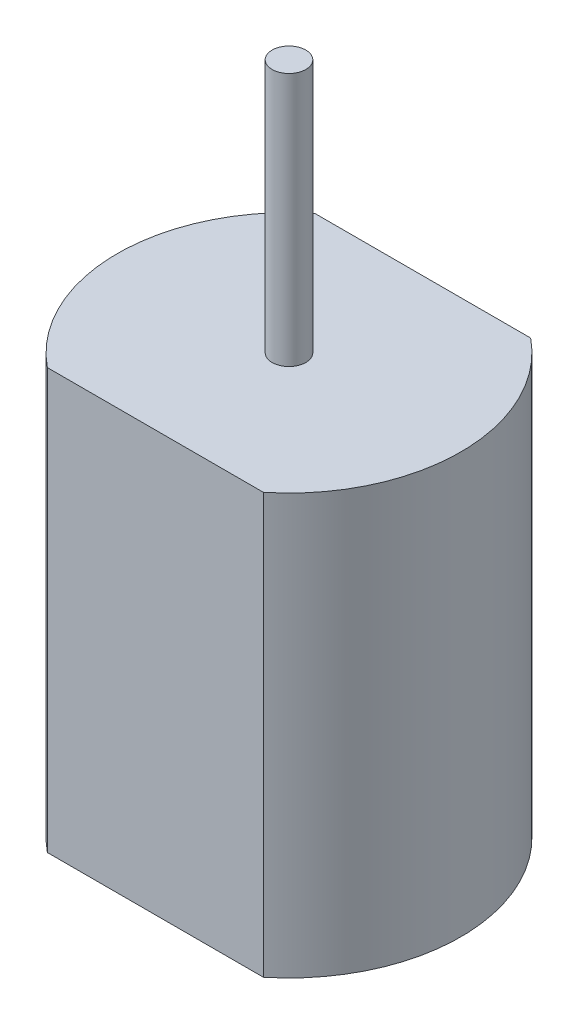
ISO-10303-21;
HEADER;
FILE_DESCRIPTION(('STEP AP214'),'2;1');
FILE_NAME('part.step','',(''),(''),'','','');
FILE_SCHEMA(('AUTOMOTIVE_DESIGN { 1 0 10303 214 1 1 1 1 }'));
ENDSEC;
DATA;
#1=APPLICATION_CONTEXT('core data for automotive mechanical design processes');
#2=APPLICATION_PROTOCOL_DEFINITION('international standard','automotive_design',2000,#1);
#3=PRODUCT_CONTEXT('',#1,'mechanical');
#4=PRODUCT('Part','Part','',(#3));
#5=PRODUCT_RELATED_PRODUCT_CATEGORY('part','',(#4));
#6=PRODUCT_DEFINITION_FORMATION('','',#4);
#7=PRODUCT_DEFINITION_CONTEXT('part definition',#1,'design');
#8=PRODUCT_DEFINITION('design','',#6,#7);
#9=PRODUCT_DEFINITION_SHAPE('','',#8);
#10=(LENGTH_UNIT() NAMED_UNIT(*) SI_UNIT(.MILLI.,.METRE.));
#11=(NAMED_UNIT(*) PLANE_ANGLE_UNIT() SI_UNIT($,.RADIAN.));
#12=(NAMED_UNIT(*) SI_UNIT($,.STERADIAN.) SOLID_ANGLE_UNIT());
#13=UNCERTAINTY_MEASURE_WITH_UNIT(LENGTH_MEASURE(1.E-05),#10,'distance_accuracy_value','');
#14=(GEOMETRIC_REPRESENTATION_CONTEXT(3) GLOBAL_UNCERTAINTY_ASSIGNED_CONTEXT((#13)) GLOBAL_UNIT_ASSIGNED_CONTEXT((#10,
#11,#12)) REPRESENTATION_CONTEXT('',''));
#15=CARTESIAN_POINT('',(0.,0.,0.));
#16=DIRECTION('',(0.,0.,1.));
#17=DIRECTION('',(1.,0.,0.));
#18=AXIS2_PLACEMENT_3D('',#15,#16,#17);
#19=CARTESIAN_POINT('',(0.,18.7,0.));
#20=DIRECTION('',(0.,-1.,0.));
#21=DIRECTION('',(0.,0.,-1.));
#22=AXIS2_PLACEMENT_3D('',#19,#20,#21);
#23=CYLINDRICAL_SURFACE('',#22,7.65);
#24=CARTESIAN_POINT('',(0.,0.,0.));
#25=DIRECTION('',(0.,1.,0.));
#26=DIRECTION('',(0.,0.,1.));
#27=AXIS2_PLACEMENT_3D('',#24,#25,#26);
#28=CIRCLE('',#27,7.65);
#29=CARTESIAN_POINT('',(4.80832611206852,0.,5.95));
#30=VERTEX_POINT('',#29);
#31=CARTESIAN_POINT('',(4.80832611206852,0.,-5.95));
#32=VERTEX_POINT('',#31);
#33=EDGE_CURVE('E113',#30,#32,#28,.T.);
#34=ORIENTED_EDGE('',*,*,#33,.T.);
#35=DIRECTION('',(0.,-1.,0.));
#36=VECTOR('',#35,1.);
#37=CARTESIAN_POINT('',(4.80832611206852,18.7,-5.95));
#38=LINE('',#37,#36);
#39=CARTESIAN_POINT('',(4.80832611206852,18.7,-5.95));
#40=VERTEX_POINT('',#39);
#41=EDGE_CURVE('E11',#40,#32,#38,.T.);
#42=ORIENTED_EDGE('',*,*,#41,.F.);
#43=CARTESIAN_POINT('',(0.,18.7,0.));
#44=DIRECTION('',(0.,1.,0.));
#45=DIRECTION('',(0.,0.,1.));
#46=AXIS2_PLACEMENT_3D('',#43,#44,#45);
#47=CIRCLE('',#46,7.65);
#48=CARTESIAN_POINT('',(4.80832611206852,18.7,5.95));
#49=VERTEX_POINT('',#48);
#50=EDGE_CURVE('E97',#49,#40,#47,.T.);
#51=ORIENTED_EDGE('',*,*,#50,.F.);
#52=DIRECTION('',(0.,-1.,0.));
#53=VECTOR('',#52,1.);
#54=CARTESIAN_POINT('',(4.80832611206852,18.7,5.95));
#55=LINE('',#54,#53);
#56=EDGE_CURVE('E109',#49,#30,#55,.T.);
#57=ORIENTED_EDGE('',*,*,#56,.T.);
#58=EDGE_LOOP('',(#34,#42,#51,#57));
#59=FACE_BOUND('',#58,.T.);
#60=ADVANCED_FACE('F45',(#59),#23,.T.);
#61=CARTESIAN_POINT('',(4.80832611206852,18.7,-5.95));
#62=DIRECTION('',(0.,0.,1.));
#63=DIRECTION('',(1.,0.,0.));
#64=AXIS2_PLACEMENT_3D('',#61,#62,#63);
#65=PLANE('',#64);
#66=DIRECTION('',(-1.,0.,0.));
#67=VECTOR('',#66,1.);
#68=CARTESIAN_POINT('',(4.80832611206852,0.,-5.95));
#69=LINE('',#68,#67);
#70=CARTESIAN_POINT('',(-4.80832611206852,0.,-5.95));
#71=VERTEX_POINT('',#70);
#72=EDGE_CURVE('E102',#32,#71,#69,.T.);
#73=ORIENTED_EDGE('',*,*,#72,.T.);
#74=DIRECTION('',(0.,-1.,0.));
#75=VECTOR('',#74,1.);
#76=CARTESIAN_POINT('',(-4.80832611206852,18.7,-5.95));
#77=LINE('',#76,#75);
#78=CARTESIAN_POINT('',(-4.80832611206852,18.7,-5.95));
#79=VERTEX_POINT('',#78);
#80=EDGE_CURVE('E54',#79,#71,#77,.T.);
#81=ORIENTED_EDGE('',*,*,#80,.F.);
#82=DIRECTION('',(-1.,0.,0.));
#83=VECTOR('',#82,1.);
#84=CARTESIAN_POINT('',(4.80832611206852,18.7,-5.95));
#85=LINE('',#84,#83);
#86=EDGE_CURVE('E92',#40,#79,#85,.T.);
#87=ORIENTED_EDGE('',*,*,#86,.F.);
#88=ORIENTED_EDGE('',*,*,#41,.T.);
#89=EDGE_LOOP('',(#73,#81,#87,#88));
#90=FACE_BOUND('',#89,.T.);
#91=ADVANCED_FACE('F101',(#90),#65,.F.);
#92=CARTESIAN_POINT('',(0.,18.7,0.));
#93=DIRECTION('',(0.,-1.,0.));
#94=DIRECTION('',(0.,0.,-1.));
#95=AXIS2_PLACEMENT_3D('',#92,#93,#94);
#96=CYLINDRICAL_SURFACE('',#95,7.65);
#97=CARTESIAN_POINT('',(0.,0.,0.));
#98=DIRECTION('',(0.,1.,0.));
#99=DIRECTION('',(0.,0.,1.));
#100=AXIS2_PLACEMENT_3D('',#97,#98,#99);
#101=CIRCLE('',#100,7.65);
#102=CARTESIAN_POINT('',(-4.80832611206852,0.,5.95));
#103=VERTEX_POINT('',#102);
#104=EDGE_CURVE('E79',#71,#103,#101,.T.);
#105=ORIENTED_EDGE('',*,*,#104,.T.);
#106=DIRECTION('',(0.,-1.,0.));
#107=VECTOR('',#106,1.);
#108=CARTESIAN_POINT('',(-4.80832611206852,18.7,5.95));
#109=LINE('',#108,#107);
#110=CARTESIAN_POINT('',(-4.80832611206852,18.7,5.95));
#111=VERTEX_POINT('',#110);
#112=EDGE_CURVE('E104',#111,#103,#109,.T.);
#113=ORIENTED_EDGE('',*,*,#112,.F.);
#114=CARTESIAN_POINT('',(0.,18.7,0.));
#115=DIRECTION('',(0.,1.,0.));
#116=DIRECTION('',(0.,0.,1.));
#117=AXIS2_PLACEMENT_3D('',#114,#115,#116);
#118=CIRCLE('',#117,7.65);
#119=EDGE_CURVE('E95',#79,#111,#118,.T.);
#120=ORIENTED_EDGE('',*,*,#119,.F.);
#121=ORIENTED_EDGE('',*,*,#80,.T.);
#122=EDGE_LOOP('',(#105,#113,#120,#121));
#123=FACE_BOUND('',#122,.T.);
#124=ADVANCED_FACE('F105',(#123),#96,.T.);
#125=CARTESIAN_POINT('',(4.80832611206852,18.7,5.95));
#126=DIRECTION('',(0.,0.,-1.));
#127=DIRECTION('',(-1.,0.,0.));
#128=AXIS2_PLACEMENT_3D('',#125,#126,#127);
#129=PLANE('',#128);
#130=DIRECTION('',(1.,0.,0.));
#131=VECTOR('',#130,1.);
#132=CARTESIAN_POINT('',(4.80832611206852,0.,5.95));
#133=LINE('',#132,#131);
#134=EDGE_CURVE('E85',#103,#30,#133,.T.);
#135=ORIENTED_EDGE('',*,*,#134,.T.);
#136=ORIENTED_EDGE('',*,*,#56,.F.);
#137=DIRECTION('',(1.,0.,0.));
#138=VECTOR('',#137,1.);
#139=CARTESIAN_POINT('',(4.80832611206852,18.7,5.95));
#140=LINE('',#139,#138);
#141=EDGE_CURVE('E62',#111,#49,#140,.T.);
#142=ORIENTED_EDGE('',*,*,#141,.F.);
#143=ORIENTED_EDGE('',*,*,#112,.T.);
#144=EDGE_LOOP('',(#135,#136,#142,#143));
#145=FACE_BOUND('',#144,.T.);
#146=ADVANCED_FACE('F127',(#145),#129,.F.);
#147=CARTESIAN_POINT('',(0.,18.7,0.));
#148=DIRECTION('',(0.,1.,0.));
#149=DIRECTION('',(0.,0.,1.));
#150=AXIS2_PLACEMENT_3D('',#147,#148,#149);
#151=PLANE('',#150);
#152=CARTESIAN_POINT('',(0.,18.7,0.));
#153=DIRECTION('',(0.,1.,0.));
#154=DIRECTION('',(0.,0.,1.));
#155=AXIS2_PLACEMENT_3D('',#152,#153,#154);
#156=CIRCLE('',#155,0.75);
#157=CARTESIAN_POINT('',(0.,18.7,0.75));
#158=VERTEX_POINT('',#157);
#159=EDGE_CURVE('E134',#158,#158,#156,.T.);
#160=ORIENTED_EDGE('',*,*,#159,.F.);
#161=EDGE_LOOP('',(#160));
#162=FACE_BOUND('',#161,.T.);
#163=ORIENTED_EDGE('',*,*,#50,.T.);
#164=ORIENTED_EDGE('',*,*,#86,.T.);
#165=ORIENTED_EDGE('',*,*,#119,.T.);
#166=ORIENTED_EDGE('',*,*,#141,.T.);
#167=EDGE_LOOP('',(#163,#164,#165,#166));
#168=FACE_BOUND('',#167,.T.);
#169=ADVANCED_FACE('F93',(#162,#168),#151,.T.);
#170=CARTESIAN_POINT('',(0.,0.,0.));
#171=DIRECTION('',(0.,1.,0.));
#172=DIRECTION('',(0.,0.,1.));
#173=AXIS2_PLACEMENT_3D('',#170,#171,#172);
#174=PLANE('',#173);
#175=ORIENTED_EDGE('',*,*,#33,.F.);
#176=ORIENTED_EDGE('',*,*,#134,.F.);
#177=ORIENTED_EDGE('',*,*,#104,.F.);
#178=ORIENTED_EDGE('',*,*,#72,.F.);
#179=EDGE_LOOP('',(#175,#176,#177,#178));
#180=FACE_BOUND('',#179,.T.);
#181=ADVANCED_FACE('F130',(#180),#174,.F.);
#182=CARTESIAN_POINT('',(0.,30.,0.));
#183=DIRECTION('',(0.,-1.,0.));
#184=DIRECTION('',(0.,0.,-1.));
#185=AXIS2_PLACEMENT_3D('',#182,#183,#184);
#186=CYLINDRICAL_SURFACE('',#185,0.75);
#187=CARTESIAN_POINT('',(0.,30.,0.));
#188=DIRECTION('',(0.,1.,0.));
#189=DIRECTION('',(0.,0.,1.));
#190=AXIS2_PLACEMENT_3D('',#187,#188,#189);
#191=CIRCLE('',#190,0.75);
#192=CARTESIAN_POINT('',(0.,30.,0.75));
#193=VERTEX_POINT('',#192);
#194=EDGE_CURVE('E117',#193,#193,#191,.T.);
#195=ORIENTED_EDGE('',*,*,#194,.F.);
#196=EDGE_LOOP('',(#195));
#197=FACE_BOUND('',#196,.T.);
#198=ORIENTED_EDGE('',*,*,#159,.T.);
#199=EDGE_LOOP('',(#198));
#200=FACE_BOUND('',#199,.T.);
#201=ADVANCED_FACE('F144',(#197,#200),#186,.T.);
#202=CARTESIAN_POINT('',(0.,30.,0.));
#203=DIRECTION('',(0.,1.,0.));
#204=DIRECTION('',(0.,0.,1.));
#205=AXIS2_PLACEMENT_3D('',#202,#203,#204);
#206=PLANE('',#205);
#207=ORIENTED_EDGE('',*,*,#194,.T.);
#208=EDGE_LOOP('',(#207));
#209=FACE_BOUND('',#208,.T.);
#210=ADVANCED_FACE('F142',(#209),#206,.T.);
#211=CLOSED_SHELL('',(#60,#91,#124,#146,#169,#181,#201,#210));
#212=MANIFOLD_SOLID_BREP('B2',#211);
#213=ADVANCED_BREP_SHAPE_REPRESENTATION('',(#18,#212),#14);
#214=SHAPE_DEFINITION_REPRESENTATION(#9,#213);
ENDSEC;
END-ISO-10303-21;
